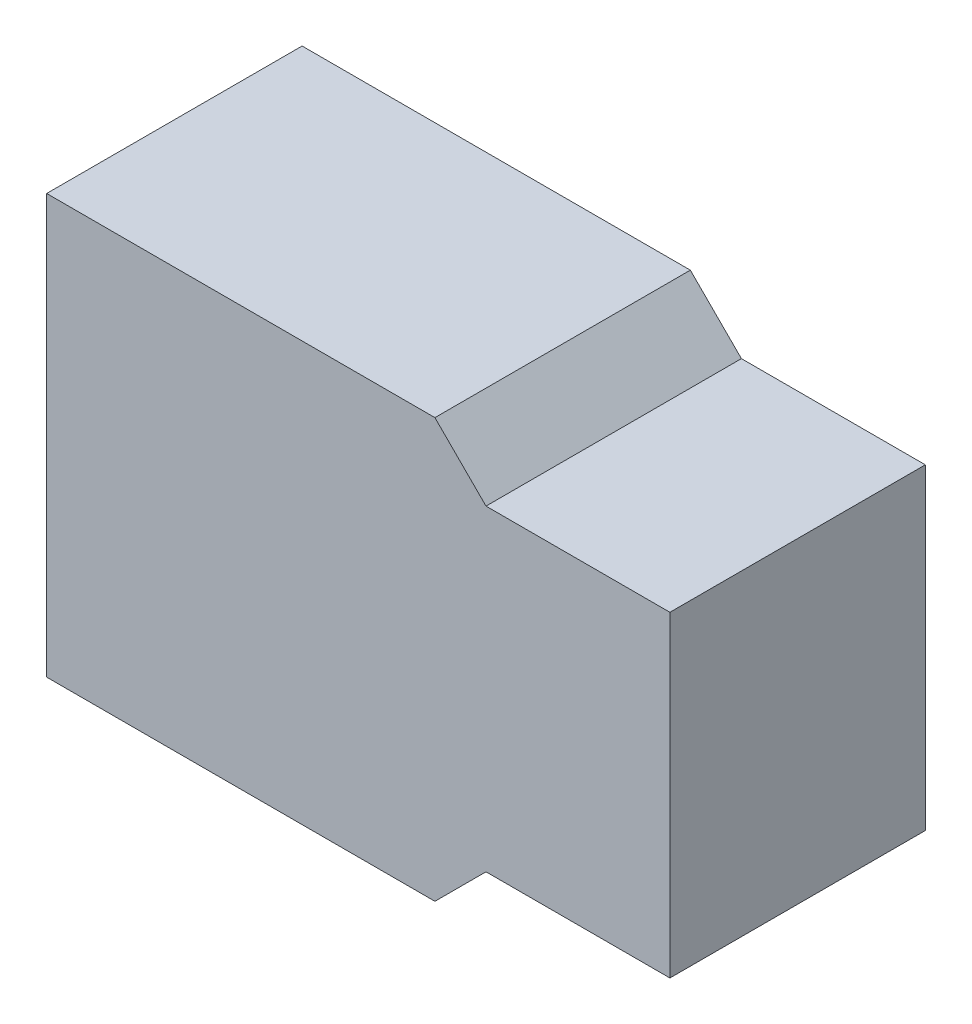
ISO-10303-21;
HEADER;
FILE_DESCRIPTION(('STEP AP214'),'2;1');
FILE_NAME('part.step','',(''),(''),'','','');
FILE_SCHEMA(('AUTOMOTIVE_DESIGN { 1 0 10303 214 1 1 1 1 }'));
ENDSEC;
DATA;
#1=APPLICATION_CONTEXT('core data for automotive mechanical design processes');
#2=APPLICATION_PROTOCOL_DEFINITION('international standard','automotive_design',2000,#1);
#3=PRODUCT_CONTEXT('',#1,'mechanical');
#4=PRODUCT('Part','Part','',(#3));
#5=PRODUCT_RELATED_PRODUCT_CATEGORY('part','',(#4));
#6=PRODUCT_DEFINITION_FORMATION('','',#4);
#7=PRODUCT_DEFINITION_CONTEXT('part definition',#1,'design');
#8=PRODUCT_DEFINITION('design','',#6,#7);
#9=PRODUCT_DEFINITION_SHAPE('','',#8);
#10=(LENGTH_UNIT() NAMED_UNIT(*) SI_UNIT(.MILLI.,.METRE.));
#11=(NAMED_UNIT(*) PLANE_ANGLE_UNIT() SI_UNIT($,.RADIAN.));
#12=(NAMED_UNIT(*) SI_UNIT($,.STERADIAN.) SOLID_ANGLE_UNIT());
#13=UNCERTAINTY_MEASURE_WITH_UNIT(LENGTH_MEASURE(1.E-05),#10,'distance_accuracy_value','');
#14=(GEOMETRIC_REPRESENTATION_CONTEXT(3) GLOBAL_UNCERTAINTY_ASSIGNED_CONTEXT((#13)) GLOBAL_UNIT_ASSIGNED_CONTEXT((#10,
#11,#12)) REPRESENTATION_CONTEXT('',''));
#15=CARTESIAN_POINT('',(0.,0.,0.));
#16=DIRECTION('',(0.,0.,1.));
#17=DIRECTION('',(1.,0.,0.));
#18=AXIS2_PLACEMENT_3D('',#15,#16,#17);
#19=CARTESIAN_POINT('',(-10.1499987593,-0.704999411948,1.7));
#20=DIRECTION('',(0.,0.,-1.));
#21=DIRECTION('',(0.,-1.,0.));
#22=AXIS2_PLACEMENT_3D('',#19,#20,#21);
#23=PLANE('',#22);
#24=DIRECTION('',(0.707106781186498,-0.707106781186598,0.));
#25=VECTOR('',#24,1.);
#26=CARTESIAN_POINT('',(-10.37999575931,-0.344997591958,1.70000000001));
#27=LINE('',#26,#25);
#28=CARTESIAN_POINT('',(-10.3799957593,-0.344997591948,1.7));
#29=VERTEX_POINT('',#28);
#30=CARTESIAN_POINT('',(-10.3299983993,-0.394994951948,1.7));
#31=VERTEX_POINT('',#30);
#32=EDGE_CURVE('E11',#29,#31,#27,.T.);
#33=ORIENTED_EDGE('',*,*,#32,.T.);
#34=DIRECTION('',(1.,0.,0.));
#35=VECTOR('',#34,1.);
#36=CARTESIAN_POINT('',(-10.32999839931,-0.394994951958,1.70000000001));
#37=LINE('',#36,#35);
#38=CARTESIAN_POINT('',(-10.1499987593,-0.394994951948,1.7));
#39=VERTEX_POINT('',#38);
#40=EDGE_CURVE('E28',#31,#39,#37,.T.);
#41=ORIENTED_EDGE('',*,*,#40,.T.);
#42=DIRECTION('',(0.,-1.,0.));
#43=VECTOR('',#42,1.);
#44=CARTESIAN_POINT('',(-10.14999875931,-0.394994951958,1.70000000001));
#45=LINE('',#44,#43);
#46=CARTESIAN_POINT('',(-10.1499987593,-0.704999411948,1.7));
#47=VERTEX_POINT('',#46);
#48=EDGE_CURVE('E155',#39,#47,#45,.T.);
#49=ORIENTED_EDGE('',*,*,#48,.T.);
#50=DIRECTION('',(-1.,0.,0.));
#51=VECTOR('',#50,1.);
#52=CARTESIAN_POINT('',(-10.14999875931,-0.704999411958,1.70000000001));
#53=LINE('',#52,#51);
#54=CARTESIAN_POINT('',(-10.3299983993,-0.704999411948,1.7));
#55=VERTEX_POINT('',#54);
#56=EDGE_CURVE('E159',#47,#55,#53,.T.);
#57=ORIENTED_EDGE('',*,*,#56,.T.);
#58=DIRECTION('',(-0.707106781186548,-0.707106781186548,0.));
#59=VECTOR('',#58,1.);
#60=CARTESIAN_POINT('',(-10.32999839931,-0.704999411958,1.70000000001));
#61=LINE('',#60,#59);
#62=CARTESIAN_POINT('',(-10.3799957593,-0.754996771948,1.7));
#63=VERTEX_POINT('',#62);
#64=EDGE_CURVE('E114',#55,#63,#61,.T.);
#65=ORIENTED_EDGE('',*,*,#64,.T.);
#66=DIRECTION('',(-1.,0.,0.));
#67=VECTOR('',#66,1.);
#68=CARTESIAN_POINT('',(-10.37999575931,-0.754996771958,1.70000000001));
#69=LINE('',#68,#67);
#70=CARTESIAN_POINT('',(-10.7599975393,-0.754996771948,1.7));
#71=VERTEX_POINT('',#70);
#72=EDGE_CURVE('E106',#63,#71,#69,.T.);
#73=ORIENTED_EDGE('',*,*,#72,.T.);
#74=DIRECTION('',(0.,1.,0.));
#75=VECTOR('',#74,1.);
#76=CARTESIAN_POINT('',(-10.75999753931,-0.754996771958,1.70000000001));
#77=LINE('',#76,#75);
#78=CARTESIAN_POINT('',(-10.7599975393,-0.344997591948,1.7));
#79=VERTEX_POINT('',#78);
#80=EDGE_CURVE('E165',#71,#79,#77,.T.);
#81=ORIENTED_EDGE('',*,*,#80,.T.);
#82=DIRECTION('',(1.,0.,0.));
#83=VECTOR('',#82,1.);
#84=CARTESIAN_POINT('',(-10.75999753931,-0.344997591958,1.70000000001));
#85=LINE('',#84,#83);
#86=EDGE_CURVE('E140',#79,#29,#85,.T.);
#87=ORIENTED_EDGE('',*,*,#86,.T.);
#88=EDGE_LOOP('',(#33,#41,#49,#57,#65,#73,#81,#87));
#89=FACE_BOUND('',#88,.T.);
#90=ADVANCED_FACE('F17',(#89),#23,.T.);
#91=CARTESIAN_POINT('',(-10.7599975393,-0.344997591948,1.7));
#92=DIRECTION('',(0.,1.,0.));
#93=DIRECTION('',(1.,0.,0.));
#94=AXIS2_PLACEMENT_3D('',#91,#92,#93);
#95=PLANE('',#94);
#96=DIRECTION('',(-1.,0.,0.));
#97=VECTOR('',#96,1.);
#98=CARTESIAN_POINT('',(-10.37999575931,-0.344997591958,1.94999950001));
#99=LINE('',#98,#97);
#100=CARTESIAN_POINT('',(-10.3799957593,-0.344997591948,1.9499995));
#101=VERTEX_POINT('',#100);
#102=CARTESIAN_POINT('',(-10.7599975393,-0.344997591948,1.9499995));
#103=VERTEX_POINT('',#102);
#104=EDGE_CURVE('E121',#101,#103,#99,.T.);
#105=ORIENTED_EDGE('',*,*,#104,.F.);
#106=DIRECTION('',(0.,0.,-1.));
#107=VECTOR('',#106,1.);
#108=CARTESIAN_POINT('',(-10.37999575931,-0.344997591958,1.94999950001));
#109=LINE('',#108,#107);
#110=EDGE_CURVE('E144',#101,#29,#109,.T.);
#111=ORIENTED_EDGE('',*,*,#110,.T.);
#112=ORIENTED_EDGE('',*,*,#86,.F.);
#113=DIRECTION('',(0.,0.,-1.));
#114=VECTOR('',#113,1.);
#115=CARTESIAN_POINT('',(-10.75999753931,-0.344997591958,1.94999950001));
#116=LINE('',#115,#114);
#117=EDGE_CURVE('E137',#103,#79,#116,.T.);
#118=ORIENTED_EDGE('',*,*,#117,.F.);
#119=EDGE_LOOP('',(#105,#111,#112,#118));
#120=FACE_BOUND('',#119,.T.);
#121=ADVANCED_FACE('F138',(#120),#95,.T.);
#122=CARTESIAN_POINT('',(-10.7599975393,-0.754996771948,1.7));
#123=DIRECTION('',(-1.,0.,0.));
#124=DIRECTION('',(0.,0.,1.));
#125=AXIS2_PLACEMENT_3D('',#122,#123,#124);
#126=PLANE('',#125);
#127=DIRECTION('',(0.,-1.,0.));
#128=VECTOR('',#127,1.);
#129=CARTESIAN_POINT('',(-10.75999753931,-0.344997591958,1.94999950001));
#130=LINE('',#129,#128);
#131=CARTESIAN_POINT('',(-10.7599975393,-0.754996771948,1.9499995));
#132=VERTEX_POINT('',#131);
#133=EDGE_CURVE('E125',#103,#132,#130,.T.);
#134=ORIENTED_EDGE('',*,*,#133,.F.);
#135=ORIENTED_EDGE('',*,*,#117,.T.);
#136=ORIENTED_EDGE('',*,*,#80,.F.);
#137=DIRECTION('',(0.,0.,-1.));
#138=VECTOR('',#137,1.);
#139=CARTESIAN_POINT('',(-10.75999753931,-0.754996771958,1.94999950001));
#140=LINE('',#139,#138);
#141=EDGE_CURVE('E21',#132,#71,#140,.T.);
#142=ORIENTED_EDGE('',*,*,#141,.F.);
#143=EDGE_LOOP('',(#134,#135,#136,#142));
#144=FACE_BOUND('',#143,.T.);
#145=ADVANCED_FACE('F19',(#144),#126,.T.);
#146=CARTESIAN_POINT('',(-10.3799957593,-0.754996771948,1.7));
#147=DIRECTION('',(0.,-1.,0.));
#148=DIRECTION('',(0.,0.,-1.));
#149=AXIS2_PLACEMENT_3D('',#146,#147,#148);
#150=PLANE('',#149);
#151=DIRECTION('',(1.,0.,0.));
#152=VECTOR('',#151,1.);
#153=CARTESIAN_POINT('',(-10.75999753931,-0.754996771958,1.94999950001));
#154=LINE('',#153,#152);
#155=CARTESIAN_POINT('',(-10.3799957593,-0.754996771948,1.9499995));
#156=VERTEX_POINT('',#155);
#157=EDGE_CURVE('E148',#132,#156,#154,.T.);
#158=ORIENTED_EDGE('',*,*,#157,.F.);
#159=ORIENTED_EDGE('',*,*,#141,.T.);
#160=ORIENTED_EDGE('',*,*,#72,.F.);
#161=DIRECTION('',(0.,0.,-1.));
#162=VECTOR('',#161,1.);
#163=CARTESIAN_POINT('',(-10.37999575931,-0.754996771958,1.94999950001));
#164=LINE('',#163,#162);
#165=EDGE_CURVE('E189',#156,#63,#164,.T.);
#166=ORIENTED_EDGE('',*,*,#165,.F.);
#167=EDGE_LOOP('',(#158,#159,#160,#166));
#168=FACE_BOUND('',#167,.T.);
#169=ADVANCED_FACE('F244',(#168),#150,.T.);
#170=CARTESIAN_POINT('',(-10.3299983993,-0.704999411948,1.7));
#171=DIRECTION('',(0.707106781186548,-0.707106781186548,0.));
#172=DIRECTION('',(0.,0.,-1.));
#173=AXIS2_PLACEMENT_3D('',#170,#171,#172);
#174=PLANE('',#173);
#175=DIRECTION('',(0.707106781186548,0.707106781186548,0.));
#176=VECTOR('',#175,1.);
#177=CARTESIAN_POINT('',(-10.37999575931,-0.754996771958,1.94999950001));
#178=LINE('',#177,#176);
#179=CARTESIAN_POINT('',(-10.3299983993,-0.704999411948,1.9499995));
#180=VERTEX_POINT('',#179);
#181=EDGE_CURVE('E76',#156,#180,#178,.T.);
#182=ORIENTED_EDGE('',*,*,#181,.F.);
#183=ORIENTED_EDGE('',*,*,#165,.T.);
#184=ORIENTED_EDGE('',*,*,#64,.F.);
#185=DIRECTION('',(0.,0.,-1.));
#186=VECTOR('',#185,1.);
#187=CARTESIAN_POINT('',(-10.32999839931,-0.704999411958,1.94999950001));
#188=LINE('',#187,#186);
#189=EDGE_CURVE('E191',#180,#55,#188,.T.);
#190=ORIENTED_EDGE('',*,*,#189,.F.);
#191=EDGE_LOOP('',(#182,#183,#184,#190));
#192=FACE_BOUND('',#191,.T.);
#193=ADVANCED_FACE('F252',(#192),#174,.T.);
#194=CARTESIAN_POINT('',(-10.1499987593,-0.704999411948,1.7));
#195=DIRECTION('',(0.,-1.,0.));
#196=DIRECTION('',(0.,0.,-1.));
#197=AXIS2_PLACEMENT_3D('',#194,#195,#196);
#198=PLANE('',#197);
#199=DIRECTION('',(1.,0.,0.));
#200=VECTOR('',#199,1.);
#201=CARTESIAN_POINT('',(-10.32999839931,-0.704999411958,1.94999950001));
#202=LINE('',#201,#200);
#203=CARTESIAN_POINT('',(-10.1499987593,-0.704999411948,1.9499995));
#204=VERTEX_POINT('',#203);
#205=EDGE_CURVE('E68',#180,#204,#202,.T.);
#206=ORIENTED_EDGE('',*,*,#205,.F.);
#207=ORIENTED_EDGE('',*,*,#189,.T.);
#208=ORIENTED_EDGE('',*,*,#56,.F.);
#209=DIRECTION('',(0.,0.,-1.));
#210=VECTOR('',#209,1.);
#211=CARTESIAN_POINT('',(-10.14999875931,-0.704999411958,1.94999950001));
#212=LINE('',#211,#210);
#213=EDGE_CURVE('E196',#204,#47,#212,.T.);
#214=ORIENTED_EDGE('',*,*,#213,.F.);
#215=EDGE_LOOP('',(#206,#207,#208,#214));
#216=FACE_BOUND('',#215,.T.);
#217=ADVANCED_FACE('F214',(#216),#198,.T.);
#218=CARTESIAN_POINT('',(-10.1499987593,-0.394994951948,1.7));
#219=DIRECTION('',(1.,0.,0.));
#220=DIRECTION('',(0.,1.,0.));
#221=AXIS2_PLACEMENT_3D('',#218,#219,#220);
#222=PLANE('',#221);
#223=DIRECTION('',(0.,1.,0.));
#224=VECTOR('',#223,1.);
#225=CARTESIAN_POINT('',(-10.14999875931,-0.704999411958,1.94999950001));
#226=LINE('',#225,#224);
#227=CARTESIAN_POINT('',(-10.1499987593,-0.394994951948,1.9499995));
#228=VERTEX_POINT('',#227);
#229=EDGE_CURVE('E61',#204,#228,#226,.T.);
#230=ORIENTED_EDGE('',*,*,#229,.F.);
#231=ORIENTED_EDGE('',*,*,#213,.T.);
#232=ORIENTED_EDGE('',*,*,#48,.F.);
#233=DIRECTION('',(0.,0.,1.));
#234=VECTOR('',#233,1.);
#235=CARTESIAN_POINT('',(-10.14999875931,-0.394994951958,1.70000000001));
#236=LINE('',#235,#234);
#237=EDGE_CURVE('E188',#39,#228,#236,.T.);
#238=ORIENTED_EDGE('',*,*,#237,.T.);
#239=EDGE_LOOP('',(#230,#231,#232,#238));
#240=FACE_BOUND('',#239,.T.);
#241=ADVANCED_FACE('F209',(#240),#222,.T.);
#242=CARTESIAN_POINT('',(-10.3299983993,-0.394994951948,1.7));
#243=DIRECTION('',(0.,1.,0.));
#244=DIRECTION('',(1.,0.,0.));
#245=AXIS2_PLACEMENT_3D('',#242,#243,#244);
#246=PLANE('',#245);
#247=DIRECTION('',(-1.,0.,0.));
#248=VECTOR('',#247,1.);
#249=CARTESIAN_POINT('',(-10.14999875931,-0.394994951958,1.94999950001));
#250=LINE('',#249,#248);
#251=CARTESIAN_POINT('',(-10.3299983993,-0.394994951948,1.9499995));
#252=VERTEX_POINT('',#251);
#253=EDGE_CURVE('E56',#228,#252,#250,.T.);
#254=ORIENTED_EDGE('',*,*,#253,.F.);
#255=ORIENTED_EDGE('',*,*,#237,.F.);
#256=ORIENTED_EDGE('',*,*,#40,.F.);
#257=DIRECTION('',(0.,0.,-1.));
#258=VECTOR('',#257,1.);
#259=CARTESIAN_POINT('',(-10.32999839931,-0.394994951958,1.94999950001));
#260=LINE('',#259,#258);
#261=EDGE_CURVE('E133',#252,#31,#260,.T.);
#262=ORIENTED_EDGE('',*,*,#261,.F.);
#263=EDGE_LOOP('',(#254,#255,#256,#262));
#264=FACE_BOUND('',#263,.T.);
#265=ADVANCED_FACE('F210',(#264),#246,.T.);
#266=CARTESIAN_POINT('',(-10.3799957593,-0.344997591948,1.7));
#267=DIRECTION('',(0.707106781186548,0.707106781186548,0.));
#268=DIRECTION('',(0.,0.,-1.));
#269=AXIS2_PLACEMENT_3D('',#266,#267,#268);
#270=PLANE('',#269);
#271=DIRECTION('',(-0.707106781186498,0.707106781186598,0.));
#272=VECTOR('',#271,1.);
#273=CARTESIAN_POINT('',(-10.32999839931,-0.394994951958,1.94999950001));
#274=LINE('',#273,#272);
#275=EDGE_CURVE('E128',#252,#101,#274,.T.);
#276=ORIENTED_EDGE('',*,*,#275,.F.);
#277=ORIENTED_EDGE('',*,*,#261,.T.);
#278=ORIENTED_EDGE('',*,*,#32,.F.);
#279=ORIENTED_EDGE('',*,*,#110,.F.);
#280=EDGE_LOOP('',(#276,#277,#278,#279));
#281=FACE_BOUND('',#280,.T.);
#282=ADVANCED_FACE('F212',(#281),#270,.T.);
#283=CARTESIAN_POINT('',(-10.1499987593,-0.704999411948,1.9499995));
#284=DIRECTION('',(0.,0.,-1.));
#285=DIRECTION('',(0.,-1.,0.));
#286=AXIS2_PLACEMENT_3D('',#283,#284,#285);
#287=PLANE('',#286);
#288=ORIENTED_EDGE('',*,*,#104,.T.);
#289=ORIENTED_EDGE('',*,*,#133,.T.);
#290=ORIENTED_EDGE('',*,*,#157,.T.);
#291=ORIENTED_EDGE('',*,*,#181,.T.);
#292=ORIENTED_EDGE('',*,*,#205,.T.);
#293=ORIENTED_EDGE('',*,*,#229,.T.);
#294=ORIENTED_EDGE('',*,*,#253,.T.);
#295=ORIENTED_EDGE('',*,*,#275,.T.);
#296=EDGE_LOOP('',(#288,#289,#290,#291,#292,#293,#294,#295));
#297=FACE_BOUND('',#296,.T.);
#298=ADVANCED_FACE('F123',(#297),#287,.F.);
#299=CLOSED_SHELL('',(#90,#121,#145,#169,#193,#217,#241,#265,#282,#298));
#300=MANIFOLD_SOLID_BREP('B1',#299);
#301=ADVANCED_BREP_SHAPE_REPRESENTATION('',(#18,#300),#14);
#302=SHAPE_DEFINITION_REPRESENTATION(#9,#301);
ENDSEC;
END-ISO-10303-21;
